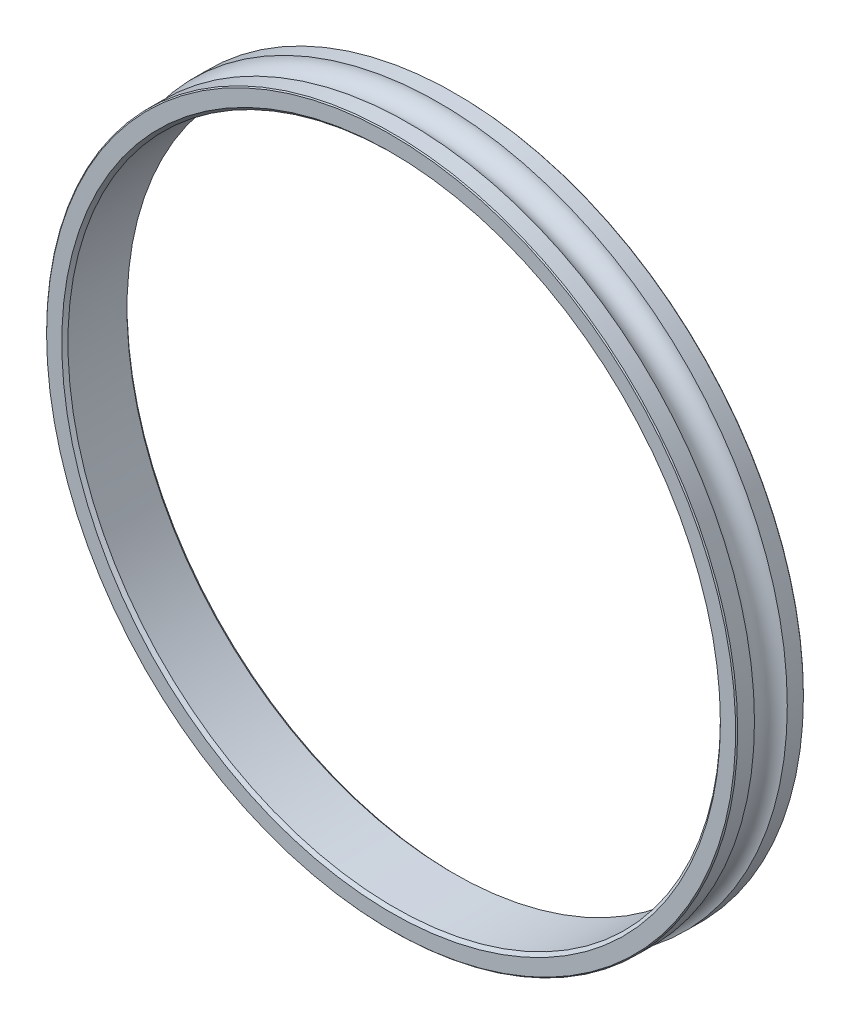
ISO-10303-21;
HEADER;
FILE_DESCRIPTION(('STEP AP214'),'2;1');
FILE_NAME('part.step','',(''),(''),'','','');
FILE_SCHEMA(('AUTOMOTIVE_DESIGN { 1 0 10303 214 1 1 1 1 }'));
ENDSEC;
DATA;
#1=APPLICATION_CONTEXT('core data for automotive mechanical design processes');
#2=APPLICATION_PROTOCOL_DEFINITION('international standard','automotive_design',2000,#1);
#3=PRODUCT_CONTEXT('',#1,'mechanical');
#4=PRODUCT('Part','Part','',(#3));
#5=PRODUCT_RELATED_PRODUCT_CATEGORY('part','',(#4));
#6=PRODUCT_DEFINITION_FORMATION('','',#4);
#7=PRODUCT_DEFINITION_CONTEXT('part definition',#1,'design');
#8=PRODUCT_DEFINITION('design','',#6,#7);
#9=PRODUCT_DEFINITION_SHAPE('','',#8);
#10=(LENGTH_UNIT() NAMED_UNIT(*) SI_UNIT(.MILLI.,.METRE.));
#11=(NAMED_UNIT(*) PLANE_ANGLE_UNIT() SI_UNIT($,.RADIAN.));
#12=(NAMED_UNIT(*) SI_UNIT($,.STERADIAN.) SOLID_ANGLE_UNIT());
#13=UNCERTAINTY_MEASURE_WITH_UNIT(LENGTH_MEASURE(1.E-05),#10,'distance_accuracy_value','');
#14=(GEOMETRIC_REPRESENTATION_CONTEXT(3) GLOBAL_UNCERTAINTY_ASSIGNED_CONTEXT((#13)) GLOBAL_UNIT_ASSIGNED_CONTEXT((#10,
#11,#12)) REPRESENTATION_CONTEXT('',''));
#15=CARTESIAN_POINT('',(0.,0.,0.));
#16=DIRECTION('',(0.,0.,1.));
#17=DIRECTION('',(1.,0.,0.));
#18=AXIS2_PLACEMENT_3D('',#15,#16,#17);
#19=CARTESIAN_POINT('',(0.,0.,6.35));
#20=DIRECTION('',(0.,0.,-1.));
#21=DIRECTION('',(-1.,0.,0.));
#22=AXIS2_PLACEMENT_3D('',#19,#20,#21);
#23=TOROIDAL_SURFACE('',#22,68.2625,3.05);
#24=CARTESIAN_POINT('',(0.,0.,3.34126272333392));
#25=DIRECTION('',(0.,0.,-1.));
#26=DIRECTION('',(1.,0.,0.));
#27=AXIS2_PLACEMENT_3D('',#24,#25,#26);
#28=CIRCLE('',#27,67.7625);
#29=CARTESIAN_POINT('',(-67.7625,0.,3.34126272333392));
#30=VERTEX_POINT('',#29);
#31=CARTESIAN_POINT('',(67.7625,0.,3.34126272333392));
#32=VERTEX_POINT('',#31);
#33=EDGE_CURVE('E125',#30,#32,#28,.T.);
#34=ORIENTED_EDGE('',*,*,#33,.F.);
#35=CARTESIAN_POINT('',(0.,0.,3.34126272333392));
#36=DIRECTION('',(0.,0.,-1.));
#37=DIRECTION('',(1.,0.,0.));
#38=AXIS2_PLACEMENT_3D('',#35,#36,#37);
#39=CIRCLE('',#38,67.7625);
#40=EDGE_CURVE('E124',#32,#30,#39,.T.);
#41=ORIENTED_EDGE('',*,*,#40,.F.);
#42=CARTESIAN_POINT('',(68.2625,0.,6.35));
#43=DIRECTION('',(0.,1.,0.));
#44=DIRECTION('',(1.,0.,0.));
#45=AXIS2_PLACEMENT_3D('',#42,#43,#44);
#46=CIRCLE('',#45,3.05);
#47=CARTESIAN_POINT('',(67.2625,0.,9.23140590684478));
#48=VERTEX_POINT('',#47);
#49=EDGE_CURVE('E11',#32,#48,#46,.T.);
#50=ORIENTED_EDGE('',*,*,#49,.T.);
#51=CARTESIAN_POINT('',(0.,0.,9.23140590684478));
#52=DIRECTION('',(0.,0.,-1.));
#53=DIRECTION('',(1.,0.,0.));
#54=AXIS2_PLACEMENT_3D('',#51,#52,#53);
#55=CIRCLE('',#54,67.2625);
#56=CARTESIAN_POINT('',(-67.2625,0.,9.23140590684478));
#57=VERTEX_POINT('',#56);
#58=EDGE_CURVE('E99',#48,#57,#55,.T.);
#59=ORIENTED_EDGE('',*,*,#58,.T.);
#60=CARTESIAN_POINT('',(0.,0.,9.23140590684478));
#61=DIRECTION('',(0.,0.,-1.));
#62=DIRECTION('',(1.,0.,0.));
#63=AXIS2_PLACEMENT_3D('',#60,#61,#62);
#64=CIRCLE('',#63,67.2625);
#65=EDGE_CURVE('E102',#57,#48,#64,.T.);
#66=ORIENTED_EDGE('',*,*,#65,.T.);
#67=ORIENTED_EDGE('',*,*,#49,.F.);
#68=EDGE_LOOP('',(#34,#41,#50,#59,#66,#67));
#69=FACE_BOUND('',#68,.T.);
#70=ADVANCED_FACE('F17',(#69),#23,.F.);
#71=CARTESIAN_POINT('',(0.,0.,0.3));
#72=DIRECTION('',(0.,0.,-1.));
#73=DIRECTION('',(-1.,0.,0.));
#74=AXIS2_PLACEMENT_3D('',#71,#72,#73);
#75=CONICAL_SURFACE('',#74,63.8,0.785398163397445);
#76=CARTESIAN_POINT('',(0.,0.,0.6));
#77=DIRECTION('',(0.,0.,1.));
#78=DIRECTION('',(-1.,0.,0.));
#79=AXIS2_PLACEMENT_3D('',#76,#77,#78);
#80=CIRCLE('',#79,63.5);
#81=CARTESIAN_POINT('',(63.5,0.,0.6));
#82=VERTEX_POINT('',#81);
#83=EDGE_CURVE('E130',#82,#82,#80,.T.);
#84=ORIENTED_EDGE('',*,*,#83,.T.);
#85=DIRECTION('',(0.707106781186545,0.,-0.70710678118655));
#86=VECTOR('',#85,1.);
#87=CARTESIAN_POINT('',(63.8,0.,0.3));
#88=LINE('',#87,#86);
#89=CARTESIAN_POINT('',(64.1,0.,0.));
#90=VERTEX_POINT('',#89);
#91=EDGE_CURVE('E28',#82,#90,#88,.T.);
#92=ORIENTED_EDGE('',*,*,#91,.T.);
#93=CARTESIAN_POINT('',(0.,0.,0.));
#94=DIRECTION('',(0.,0.,-1.));
#95=DIRECTION('',(-1.,0.,0.));
#96=AXIS2_PLACEMENT_3D('',#93,#94,#95);
#97=CIRCLE('',#96,64.1);
#98=EDGE_CURVE('E120',#90,#90,#97,.T.);
#99=ORIENTED_EDGE('',*,*,#98,.T.);
#100=ORIENTED_EDGE('',*,*,#91,.F.);
#101=EDGE_LOOP('',(#84,#92,#99,#100));
#102=FACE_BOUND('',#101,.T.);
#103=ADVANCED_FACE('F184',(#102),#75,.F.);
#104=CARTESIAN_POINT('',(0.,0.,0.));
#105=DIRECTION('',(0.,0.,1.));
#106=DIRECTION('',(-1.,0.,0.));
#107=AXIS2_PLACEMENT_3D('',#104,#105,#106);
#108=CYLINDRICAL_SURFACE('',#107,63.5);
#109=CARTESIAN_POINT('',(0.,0.,12.1));
#110=DIRECTION('',(0.,0.,-1.));
#111=DIRECTION('',(-1.,0.,0.));
#112=AXIS2_PLACEMENT_3D('',#109,#110,#111);
#113=CIRCLE('',#112,63.5);
#114=CARTESIAN_POINT('',(63.5,0.,12.1));
#115=VERTEX_POINT('',#114);
#116=EDGE_CURVE('E131',#115,#115,#113,.T.);
#117=ORIENTED_EDGE('',*,*,#116,.F.);
#118=DIRECTION('',(0.,0.,-1.));
#119=VECTOR('',#118,1.);
#120=CARTESIAN_POINT('',(63.5,0.,0.));
#121=LINE('',#120,#119);
#122=EDGE_CURVE('E126',#115,#82,#121,.T.);
#123=ORIENTED_EDGE('',*,*,#122,.T.);
#124=ORIENTED_EDGE('',*,*,#83,.F.);
#125=ORIENTED_EDGE('',*,*,#122,.F.);
#126=EDGE_LOOP('',(#117,#123,#124,#125));
#127=FACE_BOUND('',#126,.T.);
#128=ADVANCED_FACE('F244',(#127),#108,.F.);
#129=CARTESIAN_POINT('',(0.,0.,12.4));
#130=DIRECTION('',(0.,0.,1.));
#131=DIRECTION('',(-1.,0.,0.));
#132=AXIS2_PLACEMENT_3D('',#129,#130,#131);
#133=CONICAL_SURFACE('',#132,63.8,0.785398163397444);
#134=CARTESIAN_POINT('',(0.,0.,12.7));
#135=DIRECTION('',(0.,0.,1.));
#136=DIRECTION('',(-1.,0.,0.));
#137=AXIS2_PLACEMENT_3D('',#134,#135,#136);
#138=CIRCLE('',#137,64.1);
#139=CARTESIAN_POINT('',(64.1,0.,12.7));
#140=VERTEX_POINT('',#139);
#141=EDGE_CURVE('E21',#140,#140,#138,.T.);
#142=ORIENTED_EDGE('',*,*,#141,.T.);
#143=DIRECTION('',(-0.707106781186545,0.,-0.70710678118655));
#144=VECTOR('',#143,1.);
#145=CARTESIAN_POINT('',(63.8,0.,12.4));
#146=LINE('',#145,#144);
#147=EDGE_CURVE('E107',#140,#115,#146,.T.);
#148=ORIENTED_EDGE('',*,*,#147,.T.);
#149=ORIENTED_EDGE('',*,*,#116,.T.);
#150=ORIENTED_EDGE('',*,*,#147,.F.);
#151=EDGE_LOOP('',(#142,#148,#149,#150));
#152=FACE_BOUND('',#151,.T.);
#153=ADVANCED_FACE('F247',(#152),#133,.F.);
#154=CARTESIAN_POINT('',(0.,0.,10.9657029534224));
#155=DIRECTION('',(0.,0.,-1.));
#156=DIRECTION('',(-1.,0.,0.));
#157=AXIS2_PLACEMENT_3D('',#154,#155,#156);
#158=CYLINDRICAL_SURFACE('',#157,67.2625);
#159=CARTESIAN_POINT('',(0.,0.,12.5));
#160=DIRECTION('',(0.,0.,1.));
#161=DIRECTION('',(1.,0.,0.));
#162=AXIS2_PLACEMENT_3D('',#159,#160,#161);
#163=CIRCLE('',#162,67.2625);
#164=CARTESIAN_POINT('',(-67.2625,0.,12.5));
#165=VERTEX_POINT('',#164);
#166=CARTESIAN_POINT('',(67.2625,0.,12.5));
#167=VERTEX_POINT('',#166);
#168=EDGE_CURVE('E150',#165,#167,#163,.T.);
#169=ORIENTED_EDGE('',*,*,#168,.F.);
#170=CARTESIAN_POINT('',(0.,0.,12.5));
#171=DIRECTION('',(0.,0.,1.));
#172=DIRECTION('',(1.,0.,0.));
#173=AXIS2_PLACEMENT_3D('',#170,#171,#172);
#174=CIRCLE('',#173,67.2625);
#175=EDGE_CURVE('E77',#167,#165,#174,.T.);
#176=ORIENTED_EDGE('',*,*,#175,.F.);
#177=DIRECTION('',(0.,0.,-1.));
#178=VECTOR('',#177,1.);
#179=CARTESIAN_POINT('',(67.2625,0.,10.9657029534224));
#180=LINE('',#179,#178);
#181=EDGE_CURVE('E110',#167,#48,#180,.T.);
#182=ORIENTED_EDGE('',*,*,#181,.T.);
#183=ORIENTED_EDGE('',*,*,#65,.F.);
#184=ORIENTED_EDGE('',*,*,#58,.F.);
#185=ORIENTED_EDGE('',*,*,#181,.F.);
#186=EDGE_LOOP('',(#169,#176,#182,#183,#184,#185));
#187=FACE_BOUND('',#186,.T.);
#188=ADVANCED_FACE('F109',(#187),#158,.T.);
#189=CARTESIAN_POINT('',(0.,0.,12.7));
#190=DIRECTION('',(0.,0.,1.));
#191=DIRECTION('',(1.,0.,0.));
#192=AXIS2_PLACEMENT_3D('',#189,#190,#191);
#193=PLANE('',#192);
#194=ORIENTED_EDGE('',*,*,#141,.F.);
#195=EDGE_LOOP('',(#194));
#196=FACE_BOUND('',#195,.T.);
#197=CARTESIAN_POINT('',(0.,0.,12.7));
#198=DIRECTION('',(0.,0.,-1.));
#199=DIRECTION('',(1.,0.,0.));
#200=AXIS2_PLACEMENT_3D('',#197,#198,#199);
#201=CIRCLE('',#200,67.0625);
#202=CARTESIAN_POINT('',(-67.0625,0.,12.7));
#203=VERTEX_POINT('',#202);
#204=EDGE_CURVE('E137',#203,#203,#201,.T.);
#205=ORIENTED_EDGE('',*,*,#204,.F.);
#206=EDGE_LOOP('',(#205));
#207=FACE_BOUND('',#206,.T.);
#208=ADVANCED_FACE('F251',(#196,#207),#193,.T.);
#209=CARTESIAN_POINT('',(0.,0.,12.6));
#210=DIRECTION('',(0.,0.,-1.));
#211=DIRECTION('',(1.,0.,0.));
#212=AXIS2_PLACEMENT_3D('',#209,#210,#211);
#213=CONICAL_SURFACE('',#212,67.1625,0.785398163397437);
#214=ORIENTED_EDGE('',*,*,#204,.T.);
#215=DIRECTION('',(-0.70710678118654,0.,-0.707106781186555));
#216=VECTOR('',#215,1.);
#217=CARTESIAN_POINT('',(-67.1625,0.,12.6));
#218=LINE('',#217,#216);
#219=EDGE_CURVE('E86',#203,#165,#218,.T.);
#220=ORIENTED_EDGE('',*,*,#219,.T.);
#221=ORIENTED_EDGE('',*,*,#168,.T.);
#222=ORIENTED_EDGE('',*,*,#175,.T.);
#223=ORIENTED_EDGE('',*,*,#219,.F.);
#224=EDGE_LOOP('',(#214,#220,#221,#222,#223));
#225=FACE_BOUND('',#224,.T.);
#226=ADVANCED_FACE('F19',(#225),#213,.T.);
#227=CARTESIAN_POINT('',(0.,0.,1.67063136166696));
#228=DIRECTION('',(0.,0.,-1.));
#229=DIRECTION('',(-1.,0.,0.));
#230=AXIS2_PLACEMENT_3D('',#227,#228,#229);
#231=CYLINDRICAL_SURFACE('',#230,67.7625);
#232=ORIENTED_EDGE('',*,*,#33,.T.);
#233=DIRECTION('',(0.,0.,-1.));
#234=VECTOR('',#233,1.);
#235=CARTESIAN_POINT('',(67.7625,0.,1.67063136166696));
#236=LINE('',#235,#234);
#237=CARTESIAN_POINT('',(67.7625,0.,0.2));
#238=VERTEX_POINT('',#237);
#239=EDGE_CURVE('E122',#32,#238,#236,.T.);
#240=ORIENTED_EDGE('',*,*,#239,.T.);
#241=CARTESIAN_POINT('',(0.,0.,0.2));
#242=DIRECTION('',(0.,0.,-1.));
#243=DIRECTION('',(1.,0.,0.));
#244=AXIS2_PLACEMENT_3D('',#241,#242,#243);
#245=CIRCLE('',#244,67.7625);
#246=CARTESIAN_POINT('',(-67.7625,0.,0.2));
#247=VERTEX_POINT('',#246);
#248=EDGE_CURVE('E172',#247,#238,#245,.T.);
#249=ORIENTED_EDGE('',*,*,#248,.F.);
#250=CARTESIAN_POINT('',(0.,0.,0.2));
#251=DIRECTION('',(0.,0.,-1.));
#252=DIRECTION('',(1.,0.,0.));
#253=AXIS2_PLACEMENT_3D('',#250,#251,#252);
#254=CIRCLE('',#253,67.7625);
#255=EDGE_CURVE('E154',#238,#247,#254,.T.);
#256=ORIENTED_EDGE('',*,*,#255,.F.);
#257=ORIENTED_EDGE('',*,*,#239,.F.);
#258=ORIENTED_EDGE('',*,*,#40,.T.);
#259=EDGE_LOOP('',(#232,#240,#249,#256,#257,#258));
#260=FACE_BOUND('',#259,.T.);
#261=ADVANCED_FACE('F190',(#260),#231,.T.);
#262=CARTESIAN_POINT('',(0.,0.,0.));
#263=DIRECTION('',(0.,0.,1.));
#264=DIRECTION('',(1.,0.,0.));
#265=AXIS2_PLACEMENT_3D('',#262,#263,#264);
#266=PLANE('',#265);
#267=ORIENTED_EDGE('',*,*,#98,.F.);
#268=EDGE_LOOP('',(#267));
#269=FACE_BOUND('',#268,.T.);
#270=CARTESIAN_POINT('',(0.,0.,0.));
#271=DIRECTION('',(0.,0.,1.));
#272=DIRECTION('',(1.,0.,0.));
#273=AXIS2_PLACEMENT_3D('',#270,#271,#272);
#274=CIRCLE('',#273,67.5625);
#275=CARTESIAN_POINT('',(-67.5625,0.,0.));
#276=VERTEX_POINT('',#275);
#277=EDGE_CURVE('E132',#276,#276,#274,.T.);
#278=ORIENTED_EDGE('',*,*,#277,.F.);
#279=EDGE_LOOP('',(#278));
#280=FACE_BOUND('',#279,.T.);
#281=ADVANCED_FACE('F186',(#269,#280),#266,.F.);
#282=CARTESIAN_POINT('',(0.,0.,0.1));
#283=DIRECTION('',(0.,0.,1.));
#284=DIRECTION('',(1.,0.,0.));
#285=AXIS2_PLACEMENT_3D('',#282,#283,#284);
#286=CONICAL_SURFACE('',#285,67.6625,0.785398163397437);
#287=ORIENTED_EDGE('',*,*,#277,.T.);
#288=DIRECTION('',(-0.70710678118654,0.,0.707106781186555));
#289=VECTOR('',#288,1.);
#290=CARTESIAN_POINT('',(-67.6625,0.,0.1));
#291=LINE('',#290,#289);
#292=EDGE_CURVE('E135',#276,#247,#291,.T.);
#293=ORIENTED_EDGE('',*,*,#292,.T.);
#294=ORIENTED_EDGE('',*,*,#248,.T.);
#295=ORIENTED_EDGE('',*,*,#255,.T.);
#296=ORIENTED_EDGE('',*,*,#292,.F.);
#297=EDGE_LOOP('',(#287,#293,#294,#295,#296));
#298=FACE_BOUND('',#297,.T.);
#299=ADVANCED_FACE('F189',(#298),#286,.T.);
#300=CLOSED_SHELL('',(#70,#103,#128,#153,#188,#208,#226,#261,#281,#299));
#301=MANIFOLD_SOLID_BREP('B1',#300);
#302=ADVANCED_BREP_SHAPE_REPRESENTATION('',(#18,#301),#14);
#303=SHAPE_DEFINITION_REPRESENTATION(#9,#302);
ENDSEC;
END-ISO-10303-21;
